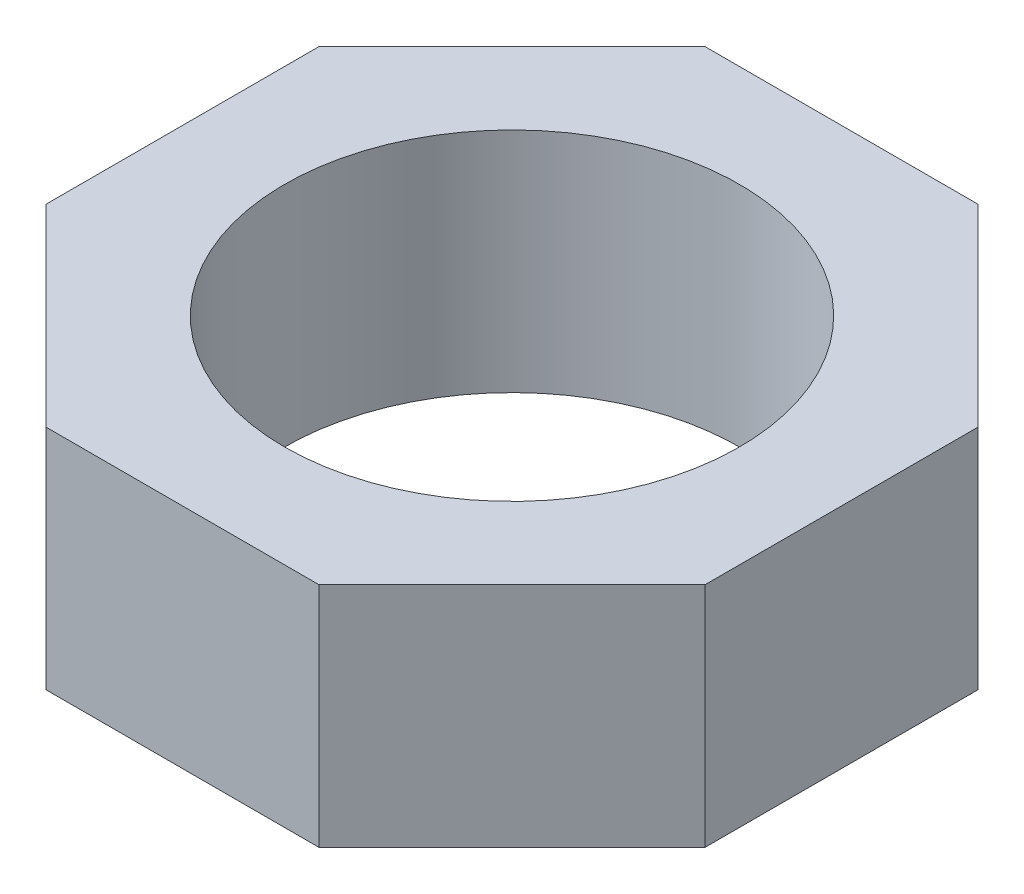
ISO-10303-21;
HEADER;
FILE_DESCRIPTION(('STEP AP214'),'2;1');
FILE_NAME('part.step','',(''),(''),'','','');
FILE_SCHEMA(('AUTOMOTIVE_DESIGN { 1 0 10303 214 1 1 1 1 }'));
ENDSEC;
DATA;
#1=APPLICATION_CONTEXT('core data for automotive mechanical design processes');
#2=APPLICATION_PROTOCOL_DEFINITION('international standard','automotive_design',2000,#1);
#3=PRODUCT_CONTEXT('',#1,'mechanical');
#4=PRODUCT('Part','Part','',(#3));
#5=PRODUCT_RELATED_PRODUCT_CATEGORY('part','',(#4));
#6=PRODUCT_DEFINITION_FORMATION('','',#4);
#7=PRODUCT_DEFINITION_CONTEXT('part definition',#1,'design');
#8=PRODUCT_DEFINITION('design','',#6,#7);
#9=PRODUCT_DEFINITION_SHAPE('','',#8);
#10=(LENGTH_UNIT() NAMED_UNIT(*) SI_UNIT(.MILLI.,.METRE.));
#11=(NAMED_UNIT(*) PLANE_ANGLE_UNIT() SI_UNIT($,.RADIAN.));
#12=(NAMED_UNIT(*) SI_UNIT($,.STERADIAN.) SOLID_ANGLE_UNIT());
#13=UNCERTAINTY_MEASURE_WITH_UNIT(LENGTH_MEASURE(1.E-05),#10,'distance_accuracy_value','');
#14=(GEOMETRIC_REPRESENTATION_CONTEXT(3) GLOBAL_UNCERTAINTY_ASSIGNED_CONTEXT((#13)) GLOBAL_UNIT_ASSIGNED_CONTEXT((#10,
#11,#12)) REPRESENTATION_CONTEXT('',''));
#15=CARTESIAN_POINT('',(0.,0.,0.));
#16=DIRECTION('',(0.,0.,1.));
#17=DIRECTION('',(1.,0.,0.));
#18=AXIS2_PLACEMENT_3D('',#15,#16,#17);
#19=CARTESIAN_POINT('',(0.,5.,0.));
#20=DIRECTION('',(0.,-1.,0.));
#21=DIRECTION('',(0.,0.,-1.));
#22=AXIS2_PLACEMENT_3D('',#19,#20,#21);
#23=PLANE('',#22);
#24=DIRECTION('',(-0.707106781186549,0.,0.707106781186546));
#25=VECTOR('',#24,1.);
#26=CARTESIAN_POINT('',(-7.24264068711929,5.,-3.));
#27=LINE('',#26,#25);
#28=CARTESIAN_POINT('',(-3.,5.,-7.24264068711928));
#29=VERTEX_POINT('',#28);
#30=CARTESIAN_POINT('',(-7.24264068711929,5.,-3.));
#31=VERTEX_POINT('',#30);
#32=EDGE_CURVE('E144',#29,#31,#27,.T.);
#33=ORIENTED_EDGE('',*,*,#32,.T.);
#34=DIRECTION('',(0.,0.,1.));
#35=VECTOR('',#34,1.);
#36=CARTESIAN_POINT('',(-7.24264068711929,5.,3.));
#37=LINE('',#36,#35);
#38=CARTESIAN_POINT('',(-7.24264068711929,5.,3.));
#39=VERTEX_POINT('',#38);
#40=EDGE_CURVE('E92',#31,#39,#37,.T.);
#41=ORIENTED_EDGE('',*,*,#40,.T.);
#42=DIRECTION('',(0.707106781186549,0.,0.707106781186546));
#43=VECTOR('',#42,1.);
#44=CARTESIAN_POINT('',(-3.,5.,7.24264068711928));
#45=LINE('',#44,#43);
#46=CARTESIAN_POINT('',(-3.,5.,7.24264068711928));
#47=VERTEX_POINT('',#46);
#48=EDGE_CURVE('E159',#39,#47,#45,.T.);
#49=ORIENTED_EDGE('',*,*,#48,.T.);
#50=DIRECTION('',(1.,0.,0.));
#51=VECTOR('',#50,1.);
#52=CARTESIAN_POINT('',(3.,5.,7.24264068711928));
#53=LINE('',#52,#51);
#54=CARTESIAN_POINT('',(3.,5.,7.24264068711928));
#55=VERTEX_POINT('',#54);
#56=EDGE_CURVE('E172',#47,#55,#53,.T.);
#57=ORIENTED_EDGE('',*,*,#56,.T.);
#58=DIRECTION('',(0.707106781186549,0.,-0.707106781186546));
#59=VECTOR('',#58,1.);
#60=CARTESIAN_POINT('',(7.24264068711929,5.,3.));
#61=LINE('',#60,#59);
#62=CARTESIAN_POINT('',(7.24264068711929,5.,3.));
#63=VERTEX_POINT('',#62);
#64=EDGE_CURVE('E111',#55,#63,#61,.T.);
#65=ORIENTED_EDGE('',*,*,#64,.T.);
#66=DIRECTION('',(0.,0.,-1.));
#67=VECTOR('',#66,1.);
#68=CARTESIAN_POINT('',(7.24264068711929,5.,-3.));
#69=LINE('',#68,#67);
#70=CARTESIAN_POINT('',(7.24264068711929,5.,-3.));
#71=VERTEX_POINT('',#70);
#72=EDGE_CURVE('E105',#63,#71,#69,.T.);
#73=ORIENTED_EDGE('',*,*,#72,.T.);
#74=DIRECTION('',(-0.707106781186549,0.,-0.707106781186546));
#75=VECTOR('',#74,1.);
#76=CARTESIAN_POINT('',(3.,5.,-7.24264068711928));
#77=LINE('',#76,#75);
#78=CARTESIAN_POINT('',(3.,5.,-7.24264068711928));
#79=VERTEX_POINT('',#78);
#80=EDGE_CURVE('E109',#71,#79,#77,.T.);
#81=ORIENTED_EDGE('',*,*,#80,.T.);
#82=DIRECTION('',(-1.,0.,0.));
#83=VECTOR('',#82,1.);
#84=CARTESIAN_POINT('',(-3.,5.,-7.24264068711928));
#85=LINE('',#84,#83);
#86=EDGE_CURVE('E49',#79,#29,#85,.T.);
#87=ORIENTED_EDGE('',*,*,#86,.T.);
#88=EDGE_LOOP('',(#33,#41,#49,#57,#65,#73,#81,#87));
#89=FACE_BOUND('',#88,.T.);
#90=CARTESIAN_POINT('',(0.,5.,0.));
#91=DIRECTION('',(0.,1.,0.));
#92=DIRECTION('',(0.,0.,1.));
#93=AXIS2_PLACEMENT_3D('',#90,#91,#92);
#94=CIRCLE('',#93,5.);
#95=CARTESIAN_POINT('',(0.,5.,5.));
#96=VERTEX_POINT('',#95);
#97=EDGE_CURVE('E133',#96,#96,#94,.T.);
#98=ORIENTED_EDGE('',*,*,#97,.F.);
#99=EDGE_LOOP('',(#98));
#100=FACE_BOUND('',#99,.T.);
#101=ADVANCED_FACE('F32',(#89,#100),#23,.F.);
#102=CARTESIAN_POINT('',(0.,0.,0.));
#103=DIRECTION('',(0.,-1.,0.));
#104=DIRECTION('',(0.,0.,-1.));
#105=AXIS2_PLACEMENT_3D('',#102,#103,#104);
#106=PLANE('',#105);
#107=DIRECTION('',(-0.707106781186549,0.,0.707106781186546));
#108=VECTOR('',#107,1.);
#109=CARTESIAN_POINT('',(-7.24264068711929,0.,-3.));
#110=LINE('',#109,#108);
#111=CARTESIAN_POINT('',(-3.,0.,-7.24264068711928));
#112=VERTEX_POINT('',#111);
#113=CARTESIAN_POINT('',(-7.24264068711929,0.,-3.));
#114=VERTEX_POINT('',#113);
#115=EDGE_CURVE('E129',#112,#114,#110,.T.);
#116=ORIENTED_EDGE('',*,*,#115,.F.);
#117=DIRECTION('',(-1.,0.,0.));
#118=VECTOR('',#117,1.);
#119=CARTESIAN_POINT('',(-3.,0.,-7.24264068711928));
#120=LINE('',#119,#118);
#121=CARTESIAN_POINT('',(3.,0.,-7.24264068711928));
#122=VERTEX_POINT('',#121);
#123=EDGE_CURVE('E84',#122,#112,#120,.T.);
#124=ORIENTED_EDGE('',*,*,#123,.F.);
#125=DIRECTION('',(-0.707106781186549,0.,-0.707106781186546));
#126=VECTOR('',#125,1.);
#127=CARTESIAN_POINT('',(3.,0.,-7.24264068711928));
#128=LINE('',#127,#126);
#129=CARTESIAN_POINT('',(7.24264068711929,0.,-3.));
#130=VERTEX_POINT('',#129);
#131=EDGE_CURVE('E78',#130,#122,#128,.T.);
#132=ORIENTED_EDGE('',*,*,#131,.F.);
#133=DIRECTION('',(0.,0.,-1.));
#134=VECTOR('',#133,1.);
#135=CARTESIAN_POINT('',(7.24264068711929,0.,-3.));
#136=LINE('',#135,#134);
#137=CARTESIAN_POINT('',(7.24264068711929,0.,3.));
#138=VERTEX_POINT('',#137);
#139=EDGE_CURVE('E119',#138,#130,#136,.T.);
#140=ORIENTED_EDGE('',*,*,#139,.F.);
#141=DIRECTION('',(0.707106781186549,0.,-0.707106781186546));
#142=VECTOR('',#141,1.);
#143=CARTESIAN_POINT('',(7.24264068711929,0.,3.));
#144=LINE('',#143,#142);
#145=CARTESIAN_POINT('',(3.,0.,7.24264068711928));
#146=VERTEX_POINT('',#145);
#147=EDGE_CURVE('E139',#146,#138,#144,.T.);
#148=ORIENTED_EDGE('',*,*,#147,.F.);
#149=DIRECTION('',(1.,0.,0.));
#150=VECTOR('',#149,1.);
#151=CARTESIAN_POINT('',(3.,0.,7.24264068711928));
#152=LINE('',#151,#150);
#153=CARTESIAN_POINT('',(-3.,0.,7.24264068711928));
#154=VERTEX_POINT('',#153);
#155=EDGE_CURVE('E137',#154,#146,#152,.T.);
#156=ORIENTED_EDGE('',*,*,#155,.F.);
#157=DIRECTION('',(0.707106781186549,0.,0.707106781186546));
#158=VECTOR('',#157,1.);
#159=CARTESIAN_POINT('',(-3.,0.,7.24264068711928));
#160=LINE('',#159,#158);
#161=CARTESIAN_POINT('',(-7.24264068711929,0.,3.));
#162=VERTEX_POINT('',#161);
#163=EDGE_CURVE('E135',#162,#154,#160,.T.);
#164=ORIENTED_EDGE('',*,*,#163,.F.);
#165=DIRECTION('',(0.,0.,1.));
#166=VECTOR('',#165,1.);
#167=CARTESIAN_POINT('',(-7.24264068711929,0.,3.));
#168=LINE('',#167,#166);
#169=EDGE_CURVE('E132',#114,#162,#168,.T.);
#170=ORIENTED_EDGE('',*,*,#169,.F.);
#171=EDGE_LOOP('',(#116,#124,#132,#140,#148,#156,#164,#170));
#172=FACE_BOUND('',#171,.T.);
#173=CARTESIAN_POINT('',(0.,0.,0.));
#174=DIRECTION('',(0.,1.,0.));
#175=DIRECTION('',(0.,0.,1.));
#176=AXIS2_PLACEMENT_3D('',#173,#174,#175);
#177=CIRCLE('',#176,5.);
#178=CARTESIAN_POINT('',(0.,0.,5.));
#179=VERTEX_POINT('',#178);
#180=EDGE_CURVE('E178',#179,#179,#177,.T.);
#181=ORIENTED_EDGE('',*,*,#180,.T.);
#182=EDGE_LOOP('',(#181));
#183=FACE_BOUND('',#182,.T.);
#184=ADVANCED_FACE('F163',(#172,#183),#106,.T.);
#185=CARTESIAN_POINT('',(-7.24264068711929,5.,-3.));
#186=DIRECTION('',(0.707106781186546,0.,0.707106781186549));
#187=DIRECTION('',(0.707106781186549,0.,-0.707106781186546));
#188=AXIS2_PLACEMENT_3D('',#185,#186,#187);
#189=PLANE('',#188);
#190=ORIENTED_EDGE('',*,*,#115,.T.);
#191=DIRECTION('',(0.,-1.,0.));
#192=VECTOR('',#191,1.);
#193=CARTESIAN_POINT('',(-7.24264068711929,5.,-3.));
#194=LINE('',#193,#192);
#195=EDGE_CURVE('E11',#31,#114,#194,.T.);
#196=ORIENTED_EDGE('',*,*,#195,.F.);
#197=ORIENTED_EDGE('',*,*,#32,.F.);
#198=DIRECTION('',(0.,-1.,0.));
#199=VECTOR('',#198,1.);
#200=CARTESIAN_POINT('',(-3.,5.,-7.24264068711928));
#201=LINE('',#200,#199);
#202=EDGE_CURVE('E125',#29,#112,#201,.T.);
#203=ORIENTED_EDGE('',*,*,#202,.T.);
#204=EDGE_LOOP('',(#190,#196,#197,#203));
#205=FACE_BOUND('',#204,.T.);
#206=ADVANCED_FACE('F34',(#205),#189,.F.);
#207=CARTESIAN_POINT('',(-7.24264068711929,5.,3.));
#208=DIRECTION('',(1.,0.,0.));
#209=DIRECTION('',(0.,0.,-1.));
#210=AXIS2_PLACEMENT_3D('',#207,#208,#209);
#211=PLANE('',#210);
#212=ORIENTED_EDGE('',*,*,#169,.T.);
#213=DIRECTION('',(0.,-1.,0.));
#214=VECTOR('',#213,1.);
#215=CARTESIAN_POINT('',(-7.24264068711929,5.,3.));
#216=LINE('',#215,#214);
#217=EDGE_CURVE('E41',#39,#162,#216,.T.);
#218=ORIENTED_EDGE('',*,*,#217,.F.);
#219=ORIENTED_EDGE('',*,*,#40,.F.);
#220=ORIENTED_EDGE('',*,*,#195,.T.);
#221=EDGE_LOOP('',(#212,#218,#219,#220));
#222=FACE_BOUND('',#221,.T.);
#223=ADVANCED_FACE('F206',(#222),#211,.F.);
#224=CARTESIAN_POINT('',(-3.,5.,7.24264068711928));
#225=DIRECTION('',(0.707106781186546,0.,-0.707106781186549));
#226=DIRECTION('',(-0.707106781186549,0.,-0.707106781186546));
#227=AXIS2_PLACEMENT_3D('',#224,#225,#226);
#228=PLANE('',#227);
#229=ORIENTED_EDGE('',*,*,#163,.T.);
#230=DIRECTION('',(0.,-1.,0.));
#231=VECTOR('',#230,1.);
#232=CARTESIAN_POINT('',(-3.,5.,7.24264068711928));
#233=LINE('',#232,#231);
#234=EDGE_CURVE('E151',#47,#154,#233,.T.);
#235=ORIENTED_EDGE('',*,*,#234,.F.);
#236=ORIENTED_EDGE('',*,*,#48,.F.);
#237=ORIENTED_EDGE('',*,*,#217,.T.);
#238=EDGE_LOOP('',(#229,#235,#236,#237));
#239=FACE_BOUND('',#238,.T.);
#240=ADVANCED_FACE('F157',(#239),#228,.F.);
#241=CARTESIAN_POINT('',(3.,5.,7.24264068711928));
#242=DIRECTION('',(0.,0.,-1.));
#243=DIRECTION('',(-1.,0.,0.));
#244=AXIS2_PLACEMENT_3D('',#241,#242,#243);
#245=PLANE('',#244);
#246=ORIENTED_EDGE('',*,*,#155,.T.);
#247=DIRECTION('',(0.,-1.,0.));
#248=VECTOR('',#247,1.);
#249=CARTESIAN_POINT('',(3.,5.,7.24264068711928));
#250=LINE('',#249,#248);
#251=EDGE_CURVE('E148',#55,#146,#250,.T.);
#252=ORIENTED_EDGE('',*,*,#251,.F.);
#253=ORIENTED_EDGE('',*,*,#56,.F.);
#254=ORIENTED_EDGE('',*,*,#234,.T.);
#255=EDGE_LOOP('',(#246,#252,#253,#254));
#256=FACE_BOUND('',#255,.T.);
#257=ADVANCED_FACE('F168',(#256),#245,.F.);
#258=CARTESIAN_POINT('',(7.24264068711929,5.,3.));
#259=DIRECTION('',(-0.707106781186546,0.,-0.707106781186549));
#260=DIRECTION('',(-0.707106781186549,0.,0.707106781186546));
#261=AXIS2_PLACEMENT_3D('',#258,#259,#260);
#262=PLANE('',#261);
#263=ORIENTED_EDGE('',*,*,#147,.T.);
#264=DIRECTION('',(0.,-1.,0.));
#265=VECTOR('',#264,1.);
#266=CARTESIAN_POINT('',(7.24264068711929,5.,3.));
#267=LINE('',#266,#265);
#268=EDGE_CURVE('E120',#63,#138,#267,.T.);
#269=ORIENTED_EDGE('',*,*,#268,.F.);
#270=ORIENTED_EDGE('',*,*,#64,.F.);
#271=ORIENTED_EDGE('',*,*,#251,.T.);
#272=EDGE_LOOP('',(#263,#269,#270,#271));
#273=FACE_BOUND('',#272,.T.);
#274=ADVANCED_FACE('F171',(#273),#262,.F.);
#275=CARTESIAN_POINT('',(7.24264068711929,5.,-3.));
#276=DIRECTION('',(-1.,0.,0.));
#277=DIRECTION('',(0.,0.,1.));
#278=AXIS2_PLACEMENT_3D('',#275,#276,#277);
#279=PLANE('',#278);
#280=ORIENTED_EDGE('',*,*,#139,.T.);
#281=DIRECTION('',(0.,-1.,0.));
#282=VECTOR('',#281,1.);
#283=CARTESIAN_POINT('',(7.24264068711929,5.,-3.));
#284=LINE('',#283,#282);
#285=EDGE_CURVE('E116',#71,#130,#284,.T.);
#286=ORIENTED_EDGE('',*,*,#285,.F.);
#287=ORIENTED_EDGE('',*,*,#72,.F.);
#288=ORIENTED_EDGE('',*,*,#268,.T.);
#289=EDGE_LOOP('',(#280,#286,#287,#288));
#290=FACE_BOUND('',#289,.T.);
#291=ADVANCED_FACE('F117',(#290),#279,.F.);
#292=CARTESIAN_POINT('',(3.,5.,-7.24264068711928));
#293=DIRECTION('',(-0.707106781186546,0.,0.707106781186549));
#294=DIRECTION('',(0.707106781186549,0.,0.707106781186546));
#295=AXIS2_PLACEMENT_3D('',#292,#293,#294);
#296=PLANE('',#295);
#297=ORIENTED_EDGE('',*,*,#131,.T.);
#298=DIRECTION('',(0.,-1.,0.));
#299=VECTOR('',#298,1.);
#300=CARTESIAN_POINT('',(3.,5.,-7.24264068711928));
#301=LINE('',#300,#299);
#302=EDGE_CURVE('E121',#79,#122,#301,.T.);
#303=ORIENTED_EDGE('',*,*,#302,.F.);
#304=ORIENTED_EDGE('',*,*,#80,.F.);
#305=ORIENTED_EDGE('',*,*,#285,.T.);
#306=EDGE_LOOP('',(#297,#303,#304,#305));
#307=FACE_BOUND('',#306,.T.);
#308=ADVANCED_FACE('F123',(#307),#296,.F.);
#309=CARTESIAN_POINT('',(-3.,5.,-7.24264068711928));
#310=DIRECTION('',(0.,0.,1.));
#311=DIRECTION('',(1.,0.,0.));
#312=AXIS2_PLACEMENT_3D('',#309,#310,#311);
#313=PLANE('',#312);
#314=ORIENTED_EDGE('',*,*,#123,.T.);
#315=ORIENTED_EDGE('',*,*,#202,.F.);
#316=ORIENTED_EDGE('',*,*,#86,.F.);
#317=ORIENTED_EDGE('',*,*,#302,.T.);
#318=EDGE_LOOP('',(#314,#315,#316,#317));
#319=FACE_BOUND('',#318,.T.);
#320=ADVANCED_FACE('F194',(#319),#313,.F.);
#321=CARTESIAN_POINT('',(0.,5.,0.));
#322=DIRECTION('',(0.,-1.,0.));
#323=DIRECTION('',(0.,0.,-1.));
#324=AXIS2_PLACEMENT_3D('',#321,#322,#323);
#325=CYLINDRICAL_SURFACE('',#324,5.);
#326=ORIENTED_EDGE('',*,*,#97,.T.);
#327=EDGE_LOOP('',(#326));
#328=FACE_BOUND('',#327,.T.);
#329=ORIENTED_EDGE('',*,*,#180,.F.);
#330=EDGE_LOOP('',(#329));
#331=FACE_BOUND('',#330,.T.);
#332=ADVANCED_FACE('F184',(#328,#331),#325,.F.);
#333=CLOSED_SHELL('',(#101,#184,#206,#223,#240,#257,#274,#291,#308,#320,#332));
#334=MANIFOLD_SOLID_BREP('B2',#333);
#335=ADVANCED_BREP_SHAPE_REPRESENTATION('',(#18,#334),#14);
#336=SHAPE_DEFINITION_REPRESENTATION(#9,#335);
ENDSEC;
END-ISO-10303-21;
